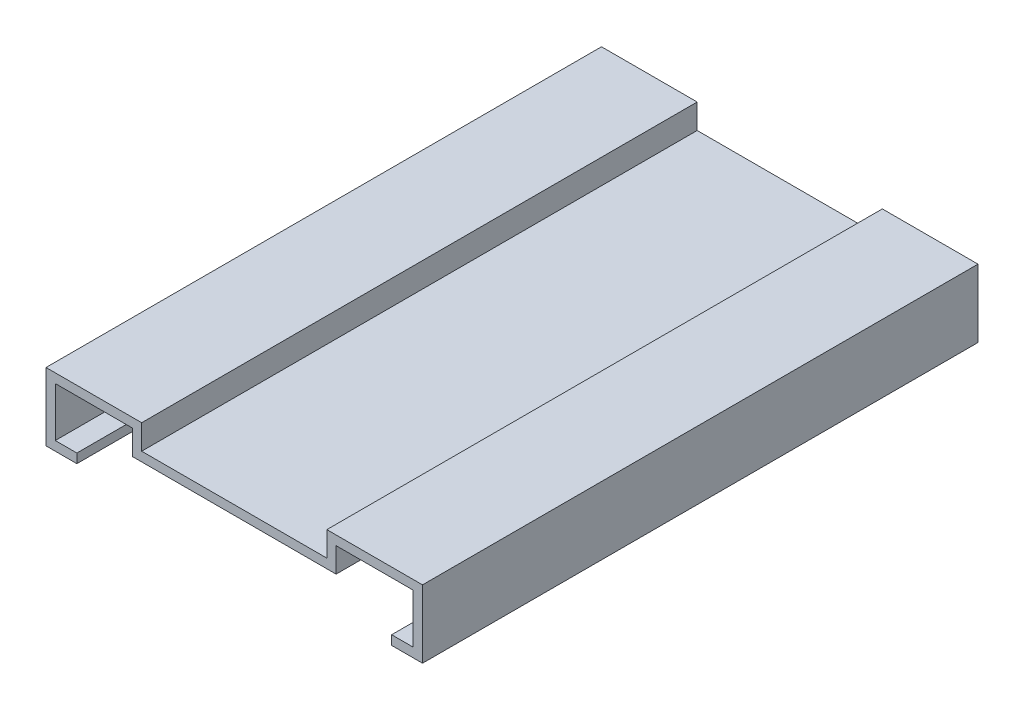
ISO-10303-21;
HEADER;
FILE_DESCRIPTION(('STEP AP214'),'2;1');
FILE_NAME('part.step','',(''),(''),'','','');
FILE_SCHEMA(('AUTOMOTIVE_DESIGN { 1 0 10303 214 1 1 1 1 }'));
ENDSEC;
DATA;
#1=APPLICATION_CONTEXT('core data for automotive mechanical design processes');
#2=APPLICATION_PROTOCOL_DEFINITION('international standard','automotive_design',2000,#1);
#3=PRODUCT_CONTEXT('',#1,'mechanical');
#4=PRODUCT('Part','Part','',(#3));
#5=PRODUCT_RELATED_PRODUCT_CATEGORY('part','',(#4));
#6=PRODUCT_DEFINITION_FORMATION('','',#4);
#7=PRODUCT_DEFINITION_CONTEXT('part definition',#1,'design');
#8=PRODUCT_DEFINITION('design','',#6,#7);
#9=PRODUCT_DEFINITION_SHAPE('','',#8);
#10=(LENGTH_UNIT() NAMED_UNIT(*) SI_UNIT(.MILLI.,.METRE.));
#11=(NAMED_UNIT(*) PLANE_ANGLE_UNIT() SI_UNIT($,.RADIAN.));
#12=(NAMED_UNIT(*) SI_UNIT($,.STERADIAN.) SOLID_ANGLE_UNIT());
#13=UNCERTAINTY_MEASURE_WITH_UNIT(LENGTH_MEASURE(1.E-05),#10,'distance_accuracy_value','');
#14=(GEOMETRIC_REPRESENTATION_CONTEXT(3) GLOBAL_UNCERTAINTY_ASSIGNED_CONTEXT((#13)) GLOBAL_UNIT_ASSIGNED_CONTEXT((#10,
#11,#12)) REPRESENTATION_CONTEXT('',''));
#15=CARTESIAN_POINT('',(0.,0.,0.));
#16=DIRECTION('',(0.,0.,1.));
#17=DIRECTION('',(1.,0.,0.));
#18=AXIS2_PLACEMENT_3D('',#15,#16,#17);
#19=CARTESIAN_POINT('',(61.,-11.,-90.));
#20=DIRECTION('',(0.,-1.,0.));
#21=DIRECTION('',(1.,0.,0.));
#22=AXIS2_PLACEMENT_3D('',#19,#20,#21);
#23=PLANE('',#22);
#24=DIRECTION('',(1.,0.,0.));
#25=VECTOR('',#24,1.);
#26=CARTESIAN_POINT('',(61.,-11.,-90.));
#27=LINE('',#26,#25);
#28=CARTESIAN_POINT('',(-61.,-11.,-90.));
#29=VERTEX_POINT('',#28);
#30=CARTESIAN_POINT('',(-51.,-11.,-90.));
#31=VERTEX_POINT('',#30);
#32=EDGE_CURVE('E187',#29,#31,#27,.T.);
#33=ORIENTED_EDGE('',*,*,#32,.T.);
#34=DIRECTION('',(0.,0.,1.));
#35=VECTOR('',#34,1.);
#36=CARTESIAN_POINT('',(-51.,-11.,-90.));
#37=LINE('',#36,#35);
#38=CARTESIAN_POINT('',(-51.,-11.,90.));
#39=VERTEX_POINT('',#38);
#40=EDGE_CURVE('E172',#31,#39,#37,.T.);
#41=ORIENTED_EDGE('',*,*,#40,.T.);
#42=DIRECTION('',(1.,0.,0.));
#43=VECTOR('',#42,1.);
#44=CARTESIAN_POINT('',(61.,-11.,90.));
#45=LINE('',#44,#43);
#46=CARTESIAN_POINT('',(-61.,-11.,90.));
#47=VERTEX_POINT('',#46);
#48=EDGE_CURVE('E273',#47,#39,#45,.T.);
#49=ORIENTED_EDGE('',*,*,#48,.F.);
#50=DIRECTION('',(0.,0.,1.));
#51=VECTOR('',#50,1.);
#52=CARTESIAN_POINT('',(-61.,-11.,-90.));
#53=LINE('',#52,#51);
#54=EDGE_CURVE('E192',#29,#47,#53,.T.);
#55=ORIENTED_EDGE('',*,*,#54,.F.);
#56=EDGE_LOOP('',(#33,#41,#49,#55));
#57=FACE_BOUND('',#56,.T.);
#58=ADVANCED_FACE('F38',(#57),#23,.T.);
#59=CARTESIAN_POINT('',(0.,0.,-90.));
#60=DIRECTION('',(0.,0.,1.));
#61=DIRECTION('',(1.,0.,0.));
#62=AXIS2_PLACEMENT_3D('',#59,#60,#61);
#63=PLANE('',#62);
#64=DIRECTION('',(0.,1.,0.));
#65=VECTOR('',#64,1.);
#66=CARTESIAN_POINT('',(-51.,-11.,-90.));
#67=LINE('',#66,#65);
#68=CARTESIAN_POINT('',(-51.,-8.00000000000001,-90.));
#69=VERTEX_POINT('',#68);
#70=EDGE_CURVE('E53',#31,#69,#67,.T.);
#71=ORIENTED_EDGE('',*,*,#70,.F.);
#72=ORIENTED_EDGE('',*,*,#32,.F.);
#73=DIRECTION('',(0.,-1.,0.));
#74=VECTOR('',#73,1.);
#75=CARTESIAN_POINT('',(-61.,-11.,-90.));
#76=LINE('',#75,#74);
#77=CARTESIAN_POINT('',(-61.,11.,-90.));
#78=VERTEX_POINT('',#77);
#79=EDGE_CURVE('E199',#78,#29,#76,.T.);
#80=ORIENTED_EDGE('',*,*,#79,.F.);
#81=DIRECTION('',(-1.,0.,0.));
#82=VECTOR('',#81,1.);
#83=CARTESIAN_POINT('',(61.,11.,-90.));
#84=LINE('',#83,#82);
#85=CARTESIAN_POINT('',(-30.,11.,-90.));
#86=VERTEX_POINT('',#85);
#87=EDGE_CURVE('E197',#86,#78,#84,.T.);
#88=ORIENTED_EDGE('',*,*,#87,.F.);
#89=DIRECTION('',(0.,-1.,0.));
#90=VECTOR('',#89,1.);
#91=CARTESIAN_POINT('',(-30.,19.,-90.));
#92=LINE('',#91,#90);
#93=CARTESIAN_POINT('',(-30.,3.,-90.));
#94=VERTEX_POINT('',#93);
#95=EDGE_CURVE('E347',#86,#94,#92,.T.);
#96=ORIENTED_EDGE('',*,*,#95,.T.);
#97=DIRECTION('',(1.,0.,0.));
#98=VECTOR('',#97,1.);
#99=CARTESIAN_POINT('',(-30.,3.,-90.));
#100=LINE('',#99,#98);
#101=CARTESIAN_POINT('',(30.,3.,-90.));
#102=VERTEX_POINT('',#101);
#103=EDGE_CURVE('E351',#94,#102,#100,.T.);
#104=ORIENTED_EDGE('',*,*,#103,.T.);
#105=DIRECTION('',(0.,1.,0.));
#106=VECTOR('',#105,1.);
#107=CARTESIAN_POINT('',(30.,19.,-90.));
#108=LINE('',#107,#106);
#109=CARTESIAN_POINT('',(30.,11.,-90.));
#110=VERTEX_POINT('',#109);
#111=EDGE_CURVE('E344',#102,#110,#108,.T.);
#112=ORIENTED_EDGE('',*,*,#111,.T.);
#113=CARTESIAN_POINT('',(61.,11.,-90.));
#114=VERTEX_POINT('',#113);
#115=EDGE_CURVE('E203',#114,#110,#84,.T.);
#116=ORIENTED_EDGE('',*,*,#115,.F.);
#117=DIRECTION('',(0.,1.,0.));
#118=VECTOR('',#117,1.);
#119=CARTESIAN_POINT('',(61.,-11.,-90.));
#120=LINE('',#119,#118);
#121=CARTESIAN_POINT('',(61.,-11.,-90.));
#122=VERTEX_POINT('',#121);
#123=EDGE_CURVE('E193',#122,#114,#120,.T.);
#124=ORIENTED_EDGE('',*,*,#123,.F.);
#125=CARTESIAN_POINT('',(51.,-11.,-90.));
#126=VERTEX_POINT('',#125);
#127=EDGE_CURVE('E194',#126,#122,#27,.T.);
#128=ORIENTED_EDGE('',*,*,#127,.F.);
#129=DIRECTION('',(0.,1.,0.));
#130=VECTOR('',#129,1.);
#131=CARTESIAN_POINT('',(51.,-11.,-90.));
#132=LINE('',#131,#130);
#133=CARTESIAN_POINT('',(51.,-8.00000000000001,-90.));
#134=VERTEX_POINT('',#133);
#135=EDGE_CURVE('E327',#126,#134,#132,.T.);
#136=ORIENTED_EDGE('',*,*,#135,.T.);
#137=DIRECTION('',(1.,0.,0.));
#138=VECTOR('',#137,1.);
#139=CARTESIAN_POINT('',(33.,-8.00000000000001,-90.));
#140=LINE('',#139,#138);
#141=CARTESIAN_POINT('',(58.,-8.00000000000001,-90.));
#142=VERTEX_POINT('',#141);
#143=EDGE_CURVE('E245',#134,#142,#140,.T.);
#144=ORIENTED_EDGE('',*,*,#143,.T.);
#145=DIRECTION('',(0.,1.,0.));
#146=VECTOR('',#145,1.);
#147=CARTESIAN_POINT('',(58.,-8.00000000000001,-90.));
#148=LINE('',#147,#146);
#149=CARTESIAN_POINT('',(58.,8.00000000000001,-90.));
#150=VERTEX_POINT('',#149);
#151=EDGE_CURVE('E260',#142,#150,#148,.T.);
#152=ORIENTED_EDGE('',*,*,#151,.T.);
#153=DIRECTION('',(-1.,0.,0.));
#154=VECTOR('',#153,1.);
#155=CARTESIAN_POINT('',(33.,8.00000000000001,-90.));
#156=LINE('',#155,#154);
#157=CARTESIAN_POINT('',(33.,8.00000000000001,-90.));
#158=VERTEX_POINT('',#157);
#159=EDGE_CURVE('E322',#150,#158,#156,.T.);
#160=ORIENTED_EDGE('',*,*,#159,.T.);
#161=DIRECTION('',(0.,-1.,0.));
#162=VECTOR('',#161,1.);
#163=CARTESIAN_POINT('',(33.,-8.00000000000001,-90.));
#164=LINE('',#163,#162);
#165=CARTESIAN_POINT('',(33.,0.,-90.));
#166=VERTEX_POINT('',#165);
#167=EDGE_CURVE('E324',#158,#166,#164,.T.);
#168=ORIENTED_EDGE('',*,*,#167,.T.);
#169=DIRECTION('',(-1.,0.,0.));
#170=VECTOR('',#169,1.);
#171=CARTESIAN_POINT('',(30.0773317785402,0.,-90.));
#172=LINE('',#171,#170);
#173=CARTESIAN_POINT('',(-33.,0.,-90.));
#174=VERTEX_POINT('',#173);
#175=EDGE_CURVE('E340',#166,#174,#172,.T.);
#176=ORIENTED_EDGE('',*,*,#175,.T.);
#177=DIRECTION('',(0.,-1.,0.));
#178=VECTOR('',#177,1.);
#179=CARTESIAN_POINT('',(-33.,-8.00000000000001,-90.));
#180=LINE('',#179,#178);
#181=CARTESIAN_POINT('',(-33.,8.00000000000001,-90.));
#182=VERTEX_POINT('',#181);
#183=EDGE_CURVE('E366',#182,#174,#180,.T.);
#184=ORIENTED_EDGE('',*,*,#183,.F.);
#185=DIRECTION('',(1.,0.,0.));
#186=VECTOR('',#185,1.);
#187=CARTESIAN_POINT('',(-33.,8.00000000000001,-90.));
#188=LINE('',#187,#186);
#189=CARTESIAN_POINT('',(-58.,8.00000000000001,-90.));
#190=VERTEX_POINT('',#189);
#191=EDGE_CURVE('E303',#190,#182,#188,.T.);
#192=ORIENTED_EDGE('',*,*,#191,.F.);
#193=DIRECTION('',(0.,1.,0.));
#194=VECTOR('',#193,1.);
#195=CARTESIAN_POINT('',(-58.,-8.00000000000001,-90.));
#196=LINE('',#195,#194);
#197=CARTESIAN_POINT('',(-58.,-8.00000000000001,-90.));
#198=VERTEX_POINT('',#197);
#199=EDGE_CURVE('E361',#198,#190,#196,.T.);
#200=ORIENTED_EDGE('',*,*,#199,.F.);
#201=DIRECTION('',(-1.,0.,0.));
#202=VECTOR('',#201,1.);
#203=CARTESIAN_POINT('',(-33.,-8.00000000000001,-90.));
#204=LINE('',#203,#202);
#205=EDGE_CURVE('E190',#69,#198,#204,.T.);
#206=ORIENTED_EDGE('',*,*,#205,.F.);
#207=EDGE_LOOP('',(#71,#72,#80,#88,#96,#104,#112,#116,#124,#128,#136,#144,#152,#160,#168,#176,
#184,#192,#200,#206));
#208=FACE_BOUND('',#207,.T.);
#209=ADVANCED_FACE('F185',(#208),#63,.F.);
#210=CARTESIAN_POINT('',(0.,0.,90.));
#211=DIRECTION('',(0.,0.,1.));
#212=DIRECTION('',(1.,0.,0.));
#213=AXIS2_PLACEMENT_3D('',#210,#211,#212);
#214=PLANE('',#213);
#215=ORIENTED_EDGE('',*,*,#48,.T.);
#216=DIRECTION('',(0.,1.,0.));
#217=VECTOR('',#216,1.);
#218=CARTESIAN_POINT('',(-51.,-11.,90.));
#219=LINE('',#218,#217);
#220=CARTESIAN_POINT('',(-51.,-8.00000000000001,90.));
#221=VERTEX_POINT('',#220);
#222=EDGE_CURVE('E175',#39,#221,#219,.T.);
#223=ORIENTED_EDGE('',*,*,#222,.T.);
#224=DIRECTION('',(-1.,0.,0.));
#225=VECTOR('',#224,1.);
#226=CARTESIAN_POINT('',(0.,-8.00000000000001,90.));
#227=LINE('',#226,#225);
#228=CARTESIAN_POINT('',(-58.,-8.00000000000001,90.));
#229=VERTEX_POINT('',#228);
#230=EDGE_CURVE('E225',#221,#229,#227,.T.);
#231=ORIENTED_EDGE('',*,*,#230,.T.);
#232=DIRECTION('',(0.,1.,0.));
#233=VECTOR('',#232,1.);
#234=CARTESIAN_POINT('',(-58.,0.,90.));
#235=LINE('',#234,#233);
#236=CARTESIAN_POINT('',(-58.,8.00000000000001,89.9999999999999));
#237=VERTEX_POINT('',#236);
#238=EDGE_CURVE('E233',#229,#237,#235,.T.);
#239=ORIENTED_EDGE('',*,*,#238,.T.);
#240=DIRECTION('',(1.,0.,0.));
#241=VECTOR('',#240,1.);
#242=CARTESIAN_POINT('',(0.,8.00000000000001,90.));
#243=LINE('',#242,#241);
#244=CARTESIAN_POINT('',(-33.,8.00000000000001,89.9999999999999));
#245=VERTEX_POINT('',#244);
#246=EDGE_CURVE('E230',#237,#245,#243,.T.);
#247=ORIENTED_EDGE('',*,*,#246,.T.);
#248=DIRECTION('',(0.,-1.,0.));
#249=VECTOR('',#248,1.);
#250=CARTESIAN_POINT('',(-33.,0.,90.));
#251=LINE('',#250,#249);
#252=CARTESIAN_POINT('',(-33.,0.,90.));
#253=VERTEX_POINT('',#252);
#254=EDGE_CURVE('E227',#245,#253,#251,.T.);
#255=ORIENTED_EDGE('',*,*,#254,.T.);
#256=DIRECTION('',(-1.,0.,0.));
#257=VECTOR('',#256,1.);
#258=CARTESIAN_POINT('',(30.0773317785402,0.,90.));
#259=LINE('',#258,#257);
#260=CARTESIAN_POINT('',(33.,0.,90.));
#261=VERTEX_POINT('',#260);
#262=EDGE_CURVE('E339',#261,#253,#259,.T.);
#263=ORIENTED_EDGE('',*,*,#262,.F.);
#264=DIRECTION('',(0.,-1.,0.));
#265=VECTOR('',#264,1.);
#266=CARTESIAN_POINT('',(33.,0.,90.));
#267=LINE('',#266,#265);
#268=CARTESIAN_POINT('',(33.,8.00000000000001,89.9999999999999));
#269=VERTEX_POINT('',#268);
#270=EDGE_CURVE('E217',#269,#261,#267,.T.);
#271=ORIENTED_EDGE('',*,*,#270,.F.);
#272=DIRECTION('',(-1.,0.,0.));
#273=VECTOR('',#272,1.);
#274=CARTESIAN_POINT('',(0.,8.00000000000001,90.));
#275=LINE('',#274,#273);
#276=CARTESIAN_POINT('',(58.,8.00000000000001,90.));
#277=VERTEX_POINT('',#276);
#278=EDGE_CURVE('E209',#277,#269,#275,.T.);
#279=ORIENTED_EDGE('',*,*,#278,.F.);
#280=DIRECTION('',(0.,1.,0.));
#281=VECTOR('',#280,1.);
#282=CARTESIAN_POINT('',(58.,0.,90.));
#283=LINE('',#282,#281);
#284=CARTESIAN_POINT('',(58.,-8.00000000000001,89.9999999999999));
#285=VERTEX_POINT('',#284);
#286=EDGE_CURVE('E222',#285,#277,#283,.T.);
#287=ORIENTED_EDGE('',*,*,#286,.F.);
#288=DIRECTION('',(1.,0.,0.));
#289=VECTOR('',#288,1.);
#290=CARTESIAN_POINT('',(0.,-8.00000000000001,90.));
#291=LINE('',#290,#289);
#292=CARTESIAN_POINT('',(51.,-8.00000000000001,90.));
#293=VERTEX_POINT('',#292);
#294=EDGE_CURVE('E220',#293,#285,#291,.T.);
#295=ORIENTED_EDGE('',*,*,#294,.F.);
#296=DIRECTION('',(0.,1.,0.));
#297=VECTOR('',#296,1.);
#298=CARTESIAN_POINT('',(51.,-11.,90.));
#299=LINE('',#298,#297);
#300=CARTESIAN_POINT('',(51.,-11.,90.));
#301=VERTEX_POINT('',#300);
#302=EDGE_CURVE('E60',#301,#293,#299,.T.);
#303=ORIENTED_EDGE('',*,*,#302,.F.);
#304=CARTESIAN_POINT('',(61.,-11.,90.));
#305=VERTEX_POINT('',#304);
#306=EDGE_CURVE('E265',#301,#305,#45,.T.);
#307=ORIENTED_EDGE('',*,*,#306,.T.);
#308=DIRECTION('',(0.,1.,0.));
#309=VECTOR('',#308,1.);
#310=CARTESIAN_POINT('',(61.,-11.,90.));
#311=LINE('',#310,#309);
#312=CARTESIAN_POINT('',(61.,11.,90.));
#313=VERTEX_POINT('',#312);
#314=EDGE_CURVE('E275',#305,#313,#311,.T.);
#315=ORIENTED_EDGE('',*,*,#314,.T.);
#316=DIRECTION('',(-1.,0.,0.));
#317=VECTOR('',#316,1.);
#318=CARTESIAN_POINT('',(61.,11.,90.));
#319=LINE('',#318,#317);
#320=CARTESIAN_POINT('',(30.,11.,90.));
#321=VERTEX_POINT('',#320);
#322=EDGE_CURVE('E278',#313,#321,#319,.T.);
#323=ORIENTED_EDGE('',*,*,#322,.T.);
#324=DIRECTION('',(0.,1.,0.));
#325=VECTOR('',#324,1.);
#326=CARTESIAN_POINT('',(30.,19.,90.));
#327=LINE('',#326,#325);
#328=CARTESIAN_POINT('',(30.,3.,90.));
#329=VERTEX_POINT('',#328);
#330=EDGE_CURVE('E342',#329,#321,#327,.T.);
#331=ORIENTED_EDGE('',*,*,#330,.F.);
#332=DIRECTION('',(1.,0.,0.));
#333=VECTOR('',#332,1.);
#334=CARTESIAN_POINT('',(-30.,3.,90.));
#335=LINE('',#334,#333);
#336=CARTESIAN_POINT('',(-30.,3.,90.));
#337=VERTEX_POINT('',#336);
#338=EDGE_CURVE('E348',#337,#329,#335,.T.);
#339=ORIENTED_EDGE('',*,*,#338,.F.);
#340=DIRECTION('',(0.,-1.,0.));
#341=VECTOR('',#340,1.);
#342=CARTESIAN_POINT('',(-30.,19.,90.));
#343=LINE('',#342,#341);
#344=CARTESIAN_POINT('',(-30.,11.,90.));
#345=VERTEX_POINT('',#344);
#346=EDGE_CURVE('E286',#345,#337,#343,.T.);
#347=ORIENTED_EDGE('',*,*,#346,.F.);
#348=CARTESIAN_POINT('',(-61.,11.,90.));
#349=VERTEX_POINT('',#348);
#350=EDGE_CURVE('E277',#345,#349,#319,.T.);
#351=ORIENTED_EDGE('',*,*,#350,.T.);
#352=DIRECTION('',(0.,-1.,0.));
#353=VECTOR('',#352,1.);
#354=CARTESIAN_POINT('',(-61.,-11.,90.));
#355=LINE('',#354,#353);
#356=EDGE_CURVE('E261',#349,#47,#355,.T.);
#357=ORIENTED_EDGE('',*,*,#356,.T.);
#358=EDGE_LOOP('',(#215,#223,#231,#239,#247,#255,#263,#271,#279,#287,#295,#303,#307,#315,#323,
#331,#339,#347,#351,#357));
#359=FACE_BOUND('',#358,.T.);
#360=ADVANCED_FACE('F249',(#359),#214,.T.);
#361=CARTESIAN_POINT('',(-33.,-8.00000000000001,-90.));
#362=DIRECTION('',(-1.,0.,0.));
#363=DIRECTION('',(0.,0.,1.));
#364=AXIS2_PLACEMENT_3D('',#361,#362,#363);
#365=PLANE('',#364);
#366=ORIENTED_EDGE('',*,*,#183,.T.);
#367=DIRECTION('',(0.,0.,1.));
#368=VECTOR('',#367,1.);
#369=CARTESIAN_POINT('',(-33.,0.,-90.));
#370=LINE('',#369,#368);
#371=EDGE_CURVE('E180',#174,#253,#370,.T.);
#372=ORIENTED_EDGE('',*,*,#371,.T.);
#373=ORIENTED_EDGE('',*,*,#254,.F.);
#374=DIRECTION('',(0.,0.,1.));
#375=VECTOR('',#374,1.);
#376=CARTESIAN_POINT('',(-33.,8.00000000000001,-90.));
#377=LINE('',#376,#375);
#378=EDGE_CURVE('E302',#182,#245,#377,.T.);
#379=ORIENTED_EDGE('',*,*,#378,.F.);
#380=EDGE_LOOP('',(#366,#372,#373,#379));
#381=FACE_BOUND('',#380,.T.);
#382=ADVANCED_FACE('F368',(#381),#365,.T.);
#383=CARTESIAN_POINT('',(-33.,-8.00000000000001,-90.));
#384=DIRECTION('',(0.,1.,0.));
#385=DIRECTION('',(0.,0.,1.));
#386=AXIS2_PLACEMENT_3D('',#383,#384,#385);
#387=PLANE('',#386);
#388=ORIENTED_EDGE('',*,*,#230,.F.);
#389=DIRECTION('',(0.,0.,-1.));
#390=VECTOR('',#389,1.);
#391=CARTESIAN_POINT('',(-51.,-8.00000000000001,-90.));
#392=LINE('',#391,#390);
#393=EDGE_CURVE('E11',#221,#69,#392,.T.);
#394=ORIENTED_EDGE('',*,*,#393,.T.);
#395=ORIENTED_EDGE('',*,*,#205,.T.);
#396=DIRECTION('',(0.,0.,1.));
#397=VECTOR('',#396,1.);
#398=CARTESIAN_POINT('',(-58.,-8.00000000000001,-90.));
#399=LINE('',#398,#397);
#400=EDGE_CURVE('E299',#198,#229,#399,.T.);
#401=ORIENTED_EDGE('',*,*,#400,.T.);
#402=EDGE_LOOP('',(#388,#394,#395,#401));
#403=FACE_BOUND('',#402,.T.);
#404=ADVANCED_FACE('F297',(#403),#387,.T.);
#405=CARTESIAN_POINT('',(61.,11.,-90.));
#406=DIRECTION('',(0.,1.,0.));
#407=DIRECTION('',(-1.,0.,0.));
#408=AXIS2_PLACEMENT_3D('',#405,#406,#407);
#409=PLANE('',#408);
#410=DIRECTION('',(0.,0.,-1.));
#411=VECTOR('',#410,1.);
#412=CARTESIAN_POINT('',(30.,11.,-90.));
#413=LINE('',#412,#411);
#414=EDGE_CURVE('E238',#321,#110,#413,.T.);
#415=ORIENTED_EDGE('',*,*,#414,.F.);
#416=ORIENTED_EDGE('',*,*,#322,.F.);
#417=DIRECTION('',(0.,0.,1.));
#418=VECTOR('',#417,1.);
#419=CARTESIAN_POINT('',(61.,11.,-90.));
#420=LINE('',#419,#418);
#421=EDGE_CURVE('E210',#114,#313,#420,.T.);
#422=ORIENTED_EDGE('',*,*,#421,.F.);
#423=ORIENTED_EDGE('',*,*,#115,.T.);
#424=EDGE_LOOP('',(#415,#416,#422,#423));
#425=FACE_BOUND('',#424,.T.);
#426=ADVANCED_FACE('F431',(#425),#409,.T.);
#427=CARTESIAN_POINT('',(-61.,-11.,-90.));
#428=DIRECTION('',(-1.,0.,0.));
#429=DIRECTION('',(0.,0.,1.));
#430=AXIS2_PLACEMENT_3D('',#427,#428,#429);
#431=PLANE('',#430);
#432=ORIENTED_EDGE('',*,*,#54,.T.);
#433=ORIENTED_EDGE('',*,*,#356,.F.);
#434=DIRECTION('',(0.,0.,1.));
#435=VECTOR('',#434,1.);
#436=CARTESIAN_POINT('',(-61.,11.,-90.));
#437=LINE('',#436,#435);
#438=EDGE_CURVE('E206',#78,#349,#437,.T.);
#439=ORIENTED_EDGE('',*,*,#438,.F.);
#440=ORIENTED_EDGE('',*,*,#79,.T.);
#441=EDGE_LOOP('',(#432,#433,#439,#440));
#442=FACE_BOUND('',#441,.T.);
#443=ADVANCED_FACE('F40',(#442),#431,.T.);
#444=DIRECTION('',(0.,0.,1.));
#445=VECTOR('',#444,1.);
#446=CARTESIAN_POINT('',(-30.,11.,-90.));
#447=LINE('',#446,#445);
#448=EDGE_CURVE('E236',#86,#345,#447,.T.);
#449=ORIENTED_EDGE('',*,*,#448,.F.);
#450=ORIENTED_EDGE('',*,*,#87,.T.);
#451=ORIENTED_EDGE('',*,*,#438,.T.);
#452=ORIENTED_EDGE('',*,*,#350,.F.);
#453=EDGE_LOOP('',(#449,#450,#451,#452));
#454=FACE_BOUND('',#453,.T.);
#455=ADVANCED_FACE('F290',(#454),#409,.T.);
#456=CARTESIAN_POINT('',(61.,-11.,-90.));
#457=DIRECTION('',(1.,0.,0.));
#458=DIRECTION('',(0.,0.,-1.));
#459=AXIS2_PLACEMENT_3D('',#456,#457,#458);
#460=PLANE('',#459);
#461=ORIENTED_EDGE('',*,*,#421,.T.);
#462=ORIENTED_EDGE('',*,*,#314,.F.);
#463=DIRECTION('',(0.,0.,1.));
#464=VECTOR('',#463,1.);
#465=CARTESIAN_POINT('',(61.,-11.,-90.));
#466=LINE('',#465,#464);
#467=EDGE_CURVE('E212',#122,#305,#466,.T.);
#468=ORIENTED_EDGE('',*,*,#467,.F.);
#469=ORIENTED_EDGE('',*,*,#123,.T.);
#470=EDGE_LOOP('',(#461,#462,#468,#469));
#471=FACE_BOUND('',#470,.T.);
#472=ADVANCED_FACE('F397',(#471),#460,.T.);
#473=DIRECTION('',(0.,0.,1.));
#474=VECTOR('',#473,1.);
#475=CARTESIAN_POINT('',(51.,-11.,-90.));
#476=LINE('',#475,#474);
#477=EDGE_CURVE('E330',#126,#301,#476,.T.);
#478=ORIENTED_EDGE('',*,*,#477,.F.);
#479=ORIENTED_EDGE('',*,*,#127,.T.);
#480=ORIENTED_EDGE('',*,*,#467,.T.);
#481=ORIENTED_EDGE('',*,*,#306,.F.);
#482=EDGE_LOOP('',(#478,#479,#480,#481));
#483=FACE_BOUND('',#482,.T.);
#484=ADVANCED_FACE('F389',(#483),#23,.T.);
#485=CARTESIAN_POINT('',(58.,-8.00000000000001,-90.));
#486=DIRECTION('',(1.,0.,0.));
#487=DIRECTION('',(0.,0.,-1.));
#488=AXIS2_PLACEMENT_3D('',#485,#486,#487);
#489=PLANE('',#488);
#490=ORIENTED_EDGE('',*,*,#286,.T.);
#491=DIRECTION('',(0.,0.,1.));
#492=VECTOR('',#491,1.);
#493=CARTESIAN_POINT('',(58.,8.00000000000001,-90.));
#494=LINE('',#493,#492);
#495=EDGE_CURVE('E256',#150,#277,#494,.T.);
#496=ORIENTED_EDGE('',*,*,#495,.F.);
#497=ORIENTED_EDGE('',*,*,#151,.F.);
#498=DIRECTION('',(0.,0.,1.));
#499=VECTOR('',#498,1.);
#500=CARTESIAN_POINT('',(58.,-8.00000000000001,-90.));
#501=LINE('',#500,#499);
#502=EDGE_CURVE('E258',#142,#285,#501,.T.);
#503=ORIENTED_EDGE('',*,*,#502,.T.);
#504=EDGE_LOOP('',(#490,#496,#497,#503));
#505=FACE_BOUND('',#504,.T.);
#506=ADVANCED_FACE('F254',(#505),#489,.F.);
#507=CARTESIAN_POINT('',(33.,-8.00000000000001,-90.));
#508=DIRECTION('',(0.,-1.,0.));
#509=DIRECTION('',(0.,0.,-1.));
#510=AXIS2_PLACEMENT_3D('',#507,#508,#509);
#511=PLANE('',#510);
#512=ORIENTED_EDGE('',*,*,#143,.F.);
#513=DIRECTION('',(0.,0.,1.));
#514=VECTOR('',#513,1.);
#515=CARTESIAN_POINT('',(51.,-8.00000000000001,-90.));
#516=LINE('',#515,#514);
#517=EDGE_CURVE('E46',#134,#293,#516,.T.);
#518=ORIENTED_EDGE('',*,*,#517,.T.);
#519=ORIENTED_EDGE('',*,*,#294,.T.);
#520=ORIENTED_EDGE('',*,*,#502,.F.);
#521=EDGE_LOOP('',(#512,#518,#519,#520));
#522=FACE_BOUND('',#521,.T.);
#523=ADVANCED_FACE('F242',(#522),#511,.F.);
#524=CARTESIAN_POINT('',(33.,-8.00000000000001,-90.));
#525=DIRECTION('',(-1.,0.,0.));
#526=DIRECTION('',(0.,0.,1.));
#527=AXIS2_PLACEMENT_3D('',#524,#525,#526);
#528=PLANE('',#527);
#529=ORIENTED_EDGE('',*,*,#270,.T.);
#530=DIRECTION('',(0.,0.,-1.));
#531=VECTOR('',#530,1.);
#532=CARTESIAN_POINT('',(33.,0.,-90.));
#533=LINE('',#532,#531);
#534=EDGE_CURVE('E332',#261,#166,#533,.T.);
#535=ORIENTED_EDGE('',*,*,#534,.T.);
#536=ORIENTED_EDGE('',*,*,#167,.F.);
#537=DIRECTION('',(0.,0.,1.));
#538=VECTOR('',#537,1.);
#539=CARTESIAN_POINT('',(33.,8.00000000000001,-90.));
#540=LINE('',#539,#538);
#541=EDGE_CURVE('E262',#158,#269,#540,.T.);
#542=ORIENTED_EDGE('',*,*,#541,.T.);
#543=EDGE_LOOP('',(#529,#535,#536,#542));
#544=FACE_BOUND('',#543,.T.);
#545=ADVANCED_FACE('F374',(#544),#528,.F.);
#546=CARTESIAN_POINT('',(33.,8.00000000000001,-90.));
#547=DIRECTION('',(0.,1.,0.));
#548=DIRECTION('',(0.,0.,1.));
#549=AXIS2_PLACEMENT_3D('',#546,#547,#548);
#550=PLANE('',#549);
#551=ORIENTED_EDGE('',*,*,#278,.T.);
#552=ORIENTED_EDGE('',*,*,#541,.F.);
#553=ORIENTED_EDGE('',*,*,#159,.F.);
#554=ORIENTED_EDGE('',*,*,#495,.T.);
#555=EDGE_LOOP('',(#551,#552,#553,#554));
#556=FACE_BOUND('',#555,.T.);
#557=ADVANCED_FACE('F377',(#556),#550,.F.);
#558=CARTESIAN_POINT('',(-58.,-8.00000000000001,-90.));
#559=DIRECTION('',(1.,0.,0.));
#560=DIRECTION('',(0.,0.,-1.));
#561=AXIS2_PLACEMENT_3D('',#558,#559,#560);
#562=PLANE('',#561);
#563=ORIENTED_EDGE('',*,*,#400,.F.);
#564=ORIENTED_EDGE('',*,*,#199,.T.);
#565=DIRECTION('',(0.,0.,1.));
#566=VECTOR('',#565,1.);
#567=CARTESIAN_POINT('',(-58.,8.00000000000001,-90.));
#568=LINE('',#567,#566);
#569=EDGE_CURVE('E308',#190,#237,#568,.T.);
#570=ORIENTED_EDGE('',*,*,#569,.T.);
#571=ORIENTED_EDGE('',*,*,#238,.F.);
#572=EDGE_LOOP('',(#563,#564,#570,#571));
#573=FACE_BOUND('',#572,.T.);
#574=ADVANCED_FACE('F306',(#573),#562,.T.);
#575=CARTESIAN_POINT('',(-33.,8.00000000000001,-90.));
#576=DIRECTION('',(0.,-1.,0.));
#577=DIRECTION('',(0.,0.,-1.));
#578=AXIS2_PLACEMENT_3D('',#575,#576,#577);
#579=PLANE('',#578);
#580=ORIENTED_EDGE('',*,*,#569,.F.);
#581=ORIENTED_EDGE('',*,*,#191,.T.);
#582=ORIENTED_EDGE('',*,*,#378,.T.);
#583=ORIENTED_EDGE('',*,*,#246,.F.);
#584=EDGE_LOOP('',(#580,#581,#582,#583));
#585=FACE_BOUND('',#584,.T.);
#586=ADVANCED_FACE('F311',(#585),#579,.T.);
#587=CARTESIAN_POINT('',(30.,19.,-90.));
#588=DIRECTION('',(1.,0.,0.));
#589=DIRECTION('',(0.,1.,0.));
#590=AXIS2_PLACEMENT_3D('',#587,#588,#589);
#591=PLANE('',#590);
#592=ORIENTED_EDGE('',*,*,#414,.T.);
#593=ORIENTED_EDGE('',*,*,#111,.F.);
#594=DIRECTION('',(0.,0.,1.));
#595=VECTOR('',#594,1.);
#596=CARTESIAN_POINT('',(30.,3.,-90.));
#597=LINE('',#596,#595);
#598=EDGE_CURVE('E359',#102,#329,#597,.T.);
#599=ORIENTED_EDGE('',*,*,#598,.T.);
#600=ORIENTED_EDGE('',*,*,#330,.T.);
#601=EDGE_LOOP('',(#592,#593,#599,#600));
#602=FACE_BOUND('',#601,.T.);
#603=ADVANCED_FACE('F419',(#602),#591,.F.);
#604=CARTESIAN_POINT('',(-30.,3.,-90.));
#605=DIRECTION('',(0.,-1.,0.));
#606=DIRECTION('',(0.,0.,-1.));
#607=AXIS2_PLACEMENT_3D('',#604,#605,#606);
#608=PLANE('',#607);
#609=ORIENTED_EDGE('',*,*,#338,.T.);
#610=ORIENTED_EDGE('',*,*,#598,.F.);
#611=ORIENTED_EDGE('',*,*,#103,.F.);
#612=DIRECTION('',(0.,0.,1.));
#613=VECTOR('',#612,1.);
#614=CARTESIAN_POINT('',(-30.,3.,-90.));
#615=LINE('',#614,#613);
#616=EDGE_CURVE('E354',#94,#337,#615,.T.);
#617=ORIENTED_EDGE('',*,*,#616,.T.);
#618=EDGE_LOOP('',(#609,#610,#611,#617));
#619=FACE_BOUND('',#618,.T.);
#620=ADVANCED_FACE('F416',(#619),#608,.F.);
#621=CARTESIAN_POINT('',(-30.,19.,-90.));
#622=DIRECTION('',(-1.,0.,0.));
#623=DIRECTION('',(0.,-1.,0.));
#624=AXIS2_PLACEMENT_3D('',#621,#622,#623);
#625=PLANE('',#624);
#626=ORIENTED_EDGE('',*,*,#448,.T.);
#627=ORIENTED_EDGE('',*,*,#346,.T.);
#628=ORIENTED_EDGE('',*,*,#616,.F.);
#629=ORIENTED_EDGE('',*,*,#95,.F.);
#630=EDGE_LOOP('',(#626,#627,#628,#629));
#631=FACE_BOUND('',#630,.T.);
#632=ADVANCED_FACE('F413',(#631),#625,.F.);
#633=CARTESIAN_POINT('',(30.0773317785402,0.,-90.));
#634=DIRECTION('',(0.,1.,0.));
#635=DIRECTION('',(0.,0.,1.));
#636=AXIS2_PLACEMENT_3D('',#633,#634,#635);
#637=PLANE('',#636);
#638=ORIENTED_EDGE('',*,*,#262,.T.);
#639=ORIENTED_EDGE('',*,*,#371,.F.);
#640=ORIENTED_EDGE('',*,*,#175,.F.);
#641=ORIENTED_EDGE('',*,*,#534,.F.);
#642=EDGE_LOOP('',(#638,#639,#640,#641));
#643=FACE_BOUND('',#642,.T.);
#644=ADVANCED_FACE('F372',(#643),#637,.F.);
#645=CARTESIAN_POINT('',(51.,-11.,-90.));
#646=DIRECTION('',(1.,0.,0.));
#647=DIRECTION('',(0.,0.,-1.));
#648=AXIS2_PLACEMENT_3D('',#645,#646,#647);
#649=PLANE('',#648);
#650=ORIENTED_EDGE('',*,*,#135,.F.);
#651=ORIENTED_EDGE('',*,*,#477,.T.);
#652=ORIENTED_EDGE('',*,*,#302,.T.);
#653=ORIENTED_EDGE('',*,*,#517,.F.);
#654=EDGE_LOOP('',(#650,#651,#652,#653));
#655=FACE_BOUND('',#654,.T.);
#656=ADVANCED_FACE('F406',(#655),#649,.F.);
#657=CARTESIAN_POINT('',(-51.,-11.,-90.));
#658=DIRECTION('',(1.,0.,0.));
#659=DIRECTION('',(0.,0.,-1.));
#660=AXIS2_PLACEMENT_3D('',#657,#658,#659);
#661=PLANE('',#660);
#662=ORIENTED_EDGE('',*,*,#222,.F.);
#663=ORIENTED_EDGE('',*,*,#40,.F.);
#664=ORIENTED_EDGE('',*,*,#70,.T.);
#665=ORIENTED_EDGE('',*,*,#393,.F.);
#666=EDGE_LOOP('',(#662,#663,#664,#665));
#667=FACE_BOUND('',#666,.T.);
#668=ADVANCED_FACE('F173',(#667),#661,.T.);
#669=CLOSED_SHELL('',(#58,#209,#360,#382,#404,#426,#443,#455,#472,#484,#506,#523,#545,#557,#574,
#586,#603,#620,#632,#644,#656,#668));
#670=MANIFOLD_SOLID_BREP('B2',#669);
#671=ADVANCED_BREP_SHAPE_REPRESENTATION('',(#18,#670),#14);
#672=SHAPE_DEFINITION_REPRESENTATION(#9,#671);
ENDSEC;
END-ISO-10303-21;
